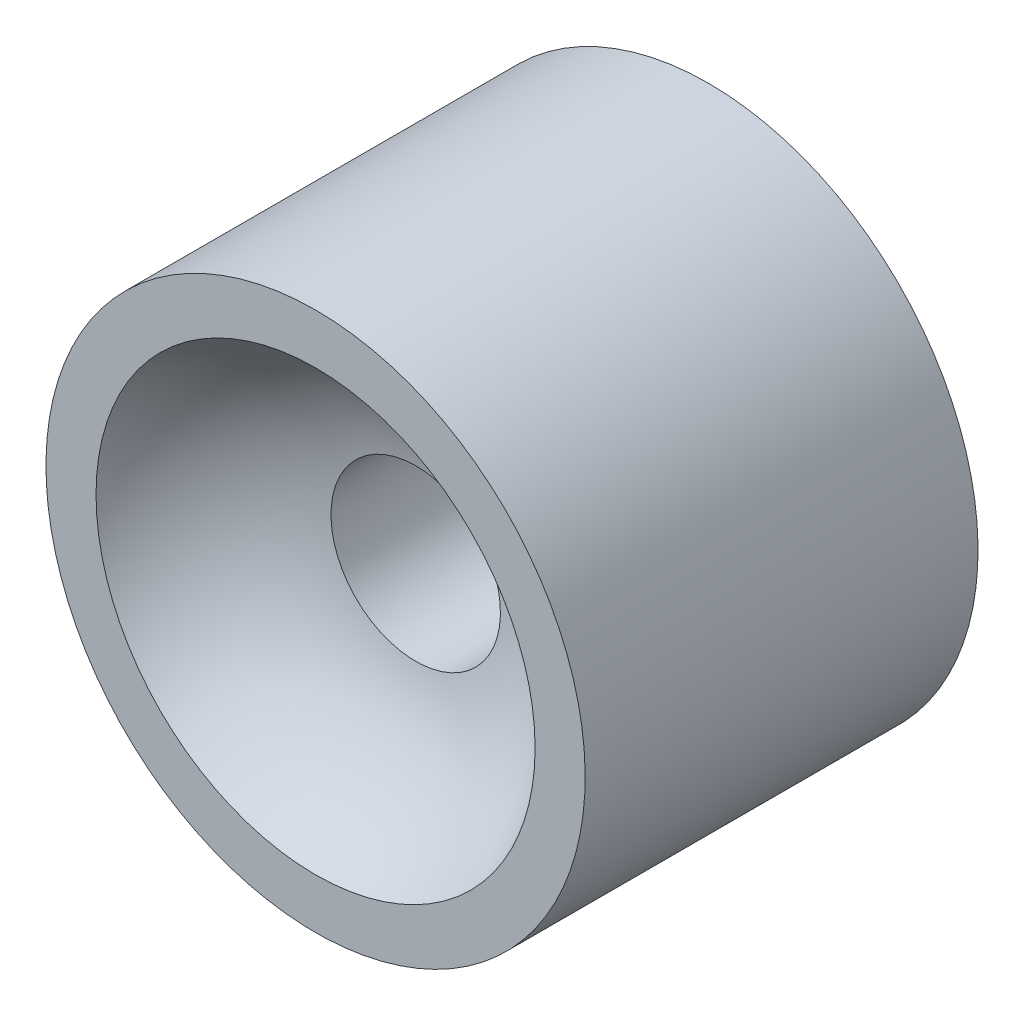
ISO-10303-21;
HEADER;
FILE_DESCRIPTION(('STEP AP214'),'2;1');
FILE_NAME('part.step','',(''),(''),'','','');
FILE_SCHEMA(('AUTOMOTIVE_DESIGN { 1 0 10303 214 1 1 1 1 }'));
ENDSEC;
DATA;
#1=APPLICATION_CONTEXT('core data for automotive mechanical design processes');
#2=APPLICATION_PROTOCOL_DEFINITION('international standard','automotive_design',2000,#1);
#3=PRODUCT_CONTEXT('',#1,'mechanical');
#4=PRODUCT('Part','Part','',(#3));
#5=PRODUCT_RELATED_PRODUCT_CATEGORY('part','',(#4));
#6=PRODUCT_DEFINITION_FORMATION('','',#4);
#7=PRODUCT_DEFINITION_CONTEXT('part definition',#1,'design');
#8=PRODUCT_DEFINITION('design','',#6,#7);
#9=PRODUCT_DEFINITION_SHAPE('','',#8);
#10=(LENGTH_UNIT() NAMED_UNIT(*) SI_UNIT(.MILLI.,.METRE.));
#11=(NAMED_UNIT(*) PLANE_ANGLE_UNIT() SI_UNIT($,.RADIAN.));
#12=(NAMED_UNIT(*) SI_UNIT($,.STERADIAN.) SOLID_ANGLE_UNIT());
#13=UNCERTAINTY_MEASURE_WITH_UNIT(LENGTH_MEASURE(1.E-05),#10,'distance_accuracy_value','');
#14=(GEOMETRIC_REPRESENTATION_CONTEXT(3) GLOBAL_UNCERTAINTY_ASSIGNED_CONTEXT((#13)) GLOBAL_UNIT_ASSIGNED_CONTEXT((#10,
#11,#12)) REPRESENTATION_CONTEXT('',''));
#15=CARTESIAN_POINT('',(0.,0.,0.));
#16=DIRECTION('',(0.,0.,1.));
#17=DIRECTION('',(1.,0.,0.));
#18=AXIS2_PLACEMENT_3D('',#15,#16,#17);
#19=CARTESIAN_POINT('',(0.,34.9999999999998,25.4999999999999));
#20=DIRECTION('',(0.,0.,0.999999999999998));
#21=DIRECTION('',(0.,-1.,0.));
#22=AXIS2_PLACEMENT_3D('',#19,#20,#21);
#23=PLANE('',#22);
#24=CARTESIAN_POINT('',(0.,0.,25.4999999999998));
#25=DIRECTION('',(0.,0.,-0.999999999999998));
#26=DIRECTION('',(0.,1.,0.));
#27=AXIS2_PLACEMENT_3D('',#24,#25,#26);
#28=CIRCLE('',#27,28.5);
#29=CARTESIAN_POINT('',(0.,28.5,25.4999999999998));
#30=VERTEX_POINT('',#29);
#31=EDGE_CURVE('E52',#30,#30,#28,.T.);
#32=ORIENTED_EDGE('',*,*,#31,.T.);
#33=EDGE_LOOP('',(#32));
#34=FACE_BOUND('',#33,.T.);
#35=CARTESIAN_POINT('',(0.,0.,25.4999999999998));
#36=DIRECTION('',(0.,0.,-0.999999999999998));
#37=DIRECTION('',(0.,1.,0.));
#38=AXIS2_PLACEMENT_3D('',#35,#36,#37);
#39=CIRCLE('',#38,35.);
#40=CARTESIAN_POINT('',(0.,35.,25.4999999999998));
#41=VERTEX_POINT('',#40);
#42=EDGE_CURVE('E10',#41,#41,#39,.T.);
#43=ORIENTED_EDGE('',*,*,#42,.F.);
#44=EDGE_LOOP('',(#43));
#45=FACE_BOUND('',#44,.T.);
#46=ADVANCED_FACE('F30',(#34,#45),#23,.T.);
#47=CARTESIAN_POINT('',(0.,0.,-12.5));
#48=DIRECTION('',(0.,0.,-0.999999999999998));
#49=DIRECTION('',(0.,1.,0.));
#50=AXIS2_PLACEMENT_3D('',#47,#48,#49);
#51=CYLINDRICAL_SURFACE('',#50,35.);
#52=CARTESIAN_POINT('',(0.,0.,-25.5));
#53=DIRECTION('',(0.,0.,-0.999999999999998));
#54=DIRECTION('',(0.,1.,0.));
#55=AXIS2_PLACEMENT_3D('',#52,#53,#54);
#56=CIRCLE('',#55,35.);
#57=CARTESIAN_POINT('',(0.,35.,-25.5));
#58=VERTEX_POINT('',#57);
#59=EDGE_CURVE('E36',#58,#58,#56,.T.);
#60=CARTESIAN_POINT('',(0.,35.,25.4999999999998));
#61=CARTESIAN_POINT('',(0.,35.,24.9687499999998));
#62=CARTESIAN_POINT('',(0.,35.,24.4374999999998));
#63=CARTESIAN_POINT('',(0.,35.,23.3749999999998));
#64=CARTESIAN_POINT('',(0.,35.,22.8437499999998));
#65=CARTESIAN_POINT('',(0.,35.,21.7812499999998));
#66=CARTESIAN_POINT('',(0.,35.,21.2499999999998));
#67=CARTESIAN_POINT('',(0.,35.,20.1874999999998));
#68=CARTESIAN_POINT('',(0.,35.,19.6562499999998));
#69=CARTESIAN_POINT('',(0.,35.,18.5937499999999));
#70=CARTESIAN_POINT('',(0.,35.,18.0624999999999));
#71=CARTESIAN_POINT('',(0.,35.,16.9999999999999));
#72=CARTESIAN_POINT('',(0.,35.,16.4687499999999));
#73=CARTESIAN_POINT('',(0.,35.,15.4062499999999));
#74=CARTESIAN_POINT('',(0.,35.,14.8749999999999));
#75=CARTESIAN_POINT('',(0.,35.,13.8124999999999));
#76=CARTESIAN_POINT('',(0.,35.,13.2812499999999));
#77=CARTESIAN_POINT('',(0.,35.,12.2187499999999));
#78=CARTESIAN_POINT('',(0.,35.,11.6874999999999));
#79=CARTESIAN_POINT('',(0.,35.,10.6249999999999));
#80=CARTESIAN_POINT('',(0.,35.,10.0937499999999));
#81=CARTESIAN_POINT('',(0.,35.,9.03124999999988));
#82=CARTESIAN_POINT('',(0.,35.,8.49999999999989));
#83=CARTESIAN_POINT('',(0.,35.,7.43749999999989));
#84=CARTESIAN_POINT('',(0.,35.,6.9062499999999));
#85=CARTESIAN_POINT('',(0.,35.,5.8437499999999));
#86=CARTESIAN_POINT('',(0.,35.,5.3124999999999));
#87=CARTESIAN_POINT('',(0.,35.,4.24999999999991));
#88=CARTESIAN_POINT('',(0.,35.,3.71874999999991));
#89=CARTESIAN_POINT('',(0.,35.,2.65624999999991));
#90=CARTESIAN_POINT('',(0.,35.,2.12499999999991));
#91=CARTESIAN_POINT('',(0.,35.,1.06249999999992));
#92=CARTESIAN_POINT('',(0.,35.,0.531249999999918));
#93=CARTESIAN_POINT('',(0.,35.,-0.531250000000078));
#94=CARTESIAN_POINT('',(0.,35.,-1.06250000000008));
#95=CARTESIAN_POINT('',(0.,35.,-2.12500000000007));
#96=CARTESIAN_POINT('',(0.,35.,-2.65625000000007));
#97=CARTESIAN_POINT('',(0.,35.,-3.71875000000007));
#98=CARTESIAN_POINT('',(0.,35.,-4.25000000000007));
#99=CARTESIAN_POINT('',(0.,35.,-5.31250000000006));
#100=CARTESIAN_POINT('',(0.,35.,-5.84375000000006));
#101=CARTESIAN_POINT('',(0.,35.,-6.90625000000006));
#102=CARTESIAN_POINT('',(0.,35.,-7.43750000000005));
#103=CARTESIAN_POINT('',(0.,35.,-8.50000000000005));
#104=CARTESIAN_POINT('',(0.,35.,-9.03125000000005));
#105=CARTESIAN_POINT('',(0.,35.,-10.09375));
#106=CARTESIAN_POINT('',(0.,35.,-10.625));
#107=CARTESIAN_POINT('',(0.,35.,-11.6875));
#108=CARTESIAN_POINT('',(0.,35.,-12.21875));
#109=CARTESIAN_POINT('',(0.,35.,-13.28125));
#110=CARTESIAN_POINT('',(0.,35.,-13.8125));
#111=CARTESIAN_POINT('',(0.,35.,-14.875));
#112=CARTESIAN_POINT('',(0.,35.,-15.40625));
#113=CARTESIAN_POINT('',(0.,35.,-16.46875));
#114=CARTESIAN_POINT('',(0.,35.,-17.));
#115=CARTESIAN_POINT('',(0.,35.,-18.0625));
#116=CARTESIAN_POINT('',(0.,35.,-18.59375));
#117=CARTESIAN_POINT('',(0.,35.,-19.65625));
#118=CARTESIAN_POINT('',(0.,35.,-20.1875));
#119=CARTESIAN_POINT('',(0.,35.,-21.25));
#120=CARTESIAN_POINT('',(0.,35.,-21.78125));
#121=CARTESIAN_POINT('',(0.,35.,-22.84375));
#122=CARTESIAN_POINT('',(0.,35.,-23.375));
#123=CARTESIAN_POINT('',(0.,35.,-24.4375));
#124=CARTESIAN_POINT('',(0.,35.,-24.96875));
#125=CARTESIAN_POINT('',(0.,35.,-25.5));
#126=B_SPLINE_CURVE_WITH_KNOTS('',3,(#60,#61,#62,#63,#64,#65,#66,#67,#68,#69,#70,#71,#72,#73,
#74,#75,#76,#77,#78,#79,#80,#81,#82,#83,#84,#85,#86,#87,#88,#89,#90,#91,#92,#93,#94,#95,#96,#97,
#98,#99,#100,#101,#102,#103,#104,#105,#106,#107,#108,#109,#110,#111,#112,#113,#114,#115,#116,
#117,#118,#119,#120,#121,#122,#123,#124,#125),.UNSPECIFIED.,.F.,.F.,(4,2,2,2,2,2,2,2,2,2,2,2,2,
2,2,2,2,2,2,2,2,2,2,2,2,2,2,2,2,2,2,2,4),(0.,1.59375,3.18749999999999,4.78124999999999,
6.37499999999998,7.96874999999997,9.56249999999996,11.15625,12.75,14.3437499999999,
15.9374999999999,17.5312499999999,19.1249999999999,20.7187499999999,22.3124999999999,
23.9062499999999,25.4999999999999,27.0937499999999,28.6874999999999,30.2812499999999,
31.8749999999999,33.4687499999999,35.0624999999999,36.6562499999999,38.2499999999999,
39.8437499999998,41.4374999999998,43.0312499999998,44.6249999999998,46.2187499999998,
47.8124999999998,49.4062499999998,50.9999999999998),.UNSPECIFIED.);
#127=EDGE_CURVE('BSEAM70',#41,#58,#126,.T.);
#128=ORIENTED_EDGE('',*,*,#42,.T.);
#129=ORIENTED_EDGE('',*,*,#59,.F.);
#130=ORIENTED_EDGE('',*,*,#127,.T.);
#131=ORIENTED_EDGE('',*,*,#127,.F.);
#132=EDGE_LOOP('',(#128,#130,#129,#131));
#133=FACE_BOUND('',#132,.T.);
#134=ADVANCED_FACE('F70',(#133),#51,.T.);
#135=CARTESIAN_POINT('',(0.,34.9999999999999,-25.5));
#136=DIRECTION('',(0.,0.,-0.999999999999998));
#137=DIRECTION('',(0.,1.,0.));
#138=AXIS2_PLACEMENT_3D('',#135,#136,#137);
#139=PLANE('',#138);
#140=ORIENTED_EDGE('',*,*,#59,.T.);
#141=EDGE_LOOP('',(#140));
#142=FACE_BOUND('',#141,.T.);
#143=CARTESIAN_POINT('',(0.,0.,-25.5));
#144=DIRECTION('',(0.,0.,-0.999999999999998));
#145=DIRECTION('',(0.,1.,0.));
#146=AXIS2_PLACEMENT_3D('',#143,#144,#145);
#147=CIRCLE('',#146,28.5);
#148=CARTESIAN_POINT('',(0.,28.4999999999999,-25.5));
#149=VERTEX_POINT('',#148);
#150=EDGE_CURVE('E40',#149,#149,#147,.T.);
#151=ORIENTED_EDGE('',*,*,#150,.F.);
#152=EDGE_LOOP('',(#151));
#153=FACE_BOUND('',#152,.T.);
#154=ADVANCED_FACE('F74',(#142,#153),#139,.T.);
#155=CARTESIAN_POINT('',(1.38777878078145E-13,0.,-37.0606216225508));
#156=DIRECTION('',(0.,0.,-0.999999999999998));
#157=DIRECTION('',(0.,1.,0.));
#158=AXIS2_PLACEMENT_3D('',#155,#156,#157);
#159=DEGENERATE_TOROIDAL_SURFACE('',#158,6.33353822324793,25.,.T.);
#160=ORIENTED_EDGE('',*,*,#150,.T.);
#161=EDGE_LOOP('',(#160));
#162=FACE_BOUND('',#161,.T.);
#163=CARTESIAN_POINT('',(0.,0.,-12.5));
#164=DIRECTION('',(0.,0.,-0.999999999999998));
#165=DIRECTION('',(0.,1.,0.));
#166=AXIS2_PLACEMENT_3D('',#163,#164,#165);
#167=CIRCLE('',#166,11.);
#168=CARTESIAN_POINT('',(0.,11.,-12.5));
#169=VERTEX_POINT('',#168);
#170=EDGE_CURVE('E44',#169,#169,#167,.T.);
#171=ORIENTED_EDGE('',*,*,#170,.F.);
#172=EDGE_LOOP('',(#171));
#173=FACE_BOUND('',#172,.T.);
#174=ADVANCED_FACE('F66',(#162,#173),#159,.F.);
#175=CARTESIAN_POINT('',(0.,0.,-12.5));
#176=DIRECTION('',(0.,0.,-0.999999999999998));
#177=DIRECTION('',(0.,1.,0.));
#178=AXIS2_PLACEMENT_3D('',#175,#176,#177);
#179=CYLINDRICAL_SURFACE('',#178,11.);
#180=CARTESIAN_POINT('',(0.,-2.08166817117217E-13,12.5));
#181=DIRECTION('',(0.,0.,-0.999999999999998));
#182=DIRECTION('',(0.,1.,0.));
#183=AXIS2_PLACEMENT_3D('',#180,#181,#182);
#184=CIRCLE('',#183,11.);
#185=CARTESIAN_POINT('',(0.,11.,12.5));
#186=VERTEX_POINT('',#185);
#187=EDGE_CURVE('E49',#186,#186,#184,.T.);
#188=CARTESIAN_POINT('',(0.,11.,-12.5));
#189=CARTESIAN_POINT('',(0.,11.,-12.2395833333333));
#190=CARTESIAN_POINT('',(0.,11.,-11.9791666666667));
#191=CARTESIAN_POINT('',(0.,11.,-11.4583333333333));
#192=CARTESIAN_POINT('',(0.,11.,-11.1979166666667));
#193=CARTESIAN_POINT('',(0.,11.,-10.6770833333333));
#194=CARTESIAN_POINT('',(0.,11.,-10.4166666666667));
#195=CARTESIAN_POINT('',(0.,11.,-9.89583333333333));
#196=CARTESIAN_POINT('',(0.,11.,-9.63541666666666));
#197=CARTESIAN_POINT('',(0.,11.,-9.11458333333333));
#198=CARTESIAN_POINT('',(0.,11.,-8.85416666666666));
#199=CARTESIAN_POINT('',(0.,11.,-8.33333333333333));
#200=CARTESIAN_POINT('',(0.,11.,-8.07291666666666));
#201=CARTESIAN_POINT('',(0.,11.,-7.55208333333333));
#202=CARTESIAN_POINT('',(0.,11.,-7.29166666666666));
#203=CARTESIAN_POINT('',(0.,11.,-6.77083333333333));
#204=CARTESIAN_POINT('',(0.,11.,-6.51041666666666));
#205=CARTESIAN_POINT('',(0.,11.,-5.98958333333333));
#206=CARTESIAN_POINT('',(0.,11.,-5.72916666666666));
#207=CARTESIAN_POINT('',(0.,11.,-5.20833333333333));
#208=CARTESIAN_POINT('',(0.,11.,-4.94791666666666));
#209=CARTESIAN_POINT('',(0.,11.,-4.42708333333333));
#210=CARTESIAN_POINT('',(0.,11.,-4.16666666666666));
#211=CARTESIAN_POINT('',(0.,11.,-3.64583333333333));
#212=CARTESIAN_POINT('',(0.,11.,-3.38541666666666));
#213=CARTESIAN_POINT('',(0.,11.,-2.86458333333333));
#214=CARTESIAN_POINT('',(0.,11.,-2.60416666666666));
#215=CARTESIAN_POINT('',(0.,11.,-2.08333333333333));
#216=CARTESIAN_POINT('',(0.,11.,-1.82291666666666));
#217=CARTESIAN_POINT('',(0.,11.,-1.30208333333333));
#218=CARTESIAN_POINT('',(0.,11.,-1.04166666666666));
#219=CARTESIAN_POINT('',(0.,11.,-0.520833333333329));
#220=CARTESIAN_POINT('',(0.,11.,-0.260416666666663));
#221=CARTESIAN_POINT('',(0.,11.,0.26041666666667));
#222=CARTESIAN_POINT('',(0.,11.,0.520833333333336));
#223=CARTESIAN_POINT('',(0.,11.,1.04166666666667));
#224=CARTESIAN_POINT('',(0.,11.,1.30208333333334));
#225=CARTESIAN_POINT('',(0.,11.,1.82291666666667));
#226=CARTESIAN_POINT('',(0.,11.,2.08333333333334));
#227=CARTESIAN_POINT('',(0.,11.,2.60416666666667));
#228=CARTESIAN_POINT('',(0.,11.,2.86458333333334));
#229=CARTESIAN_POINT('',(0.,11.,3.38541666666667));
#230=CARTESIAN_POINT('',(0.,11.,3.64583333333333));
#231=CARTESIAN_POINT('',(0.,11.,4.16666666666667));
#232=CARTESIAN_POINT('',(0.,11.,4.42708333333334));
#233=CARTESIAN_POINT('',(0.,11.,4.94791666666667));
#234=CARTESIAN_POINT('',(0.,11.,5.20833333333334));
#235=CARTESIAN_POINT('',(0.,11.,5.72916666666667));
#236=CARTESIAN_POINT('',(0.,11.,5.98958333333334));
#237=CARTESIAN_POINT('',(0.,11.,6.51041666666667));
#238=CARTESIAN_POINT('',(0.,11.,6.77083333333333));
#239=CARTESIAN_POINT('',(0.,11.,7.29166666666667));
#240=CARTESIAN_POINT('',(0.,11.,7.55208333333333));
#241=CARTESIAN_POINT('',(0.,11.,8.07291666666667));
#242=CARTESIAN_POINT('',(0.,11.,8.33333333333333));
#243=CARTESIAN_POINT('',(0.,11.,8.85416666666667));
#244=CARTESIAN_POINT('',(0.,11.,9.11458333333333));
#245=CARTESIAN_POINT('',(0.,11.,9.63541666666667));
#246=CARTESIAN_POINT('',(0.,11.,9.89583333333333));
#247=CARTESIAN_POINT('',(0.,11.,10.4166666666667));
#248=CARTESIAN_POINT('',(0.,11.,10.6770833333333));
#249=CARTESIAN_POINT('',(0.,11.,11.1979166666667));
#250=CARTESIAN_POINT('',(0.,11.,11.4583333333333));
#251=CARTESIAN_POINT('',(0.,11.,11.9791666666667));
#252=CARTESIAN_POINT('',(0.,11.,12.2395833333333));
#253=CARTESIAN_POINT('',(0.,11.,12.5));
#254=B_SPLINE_CURVE_WITH_KNOTS('',3,(#188,#189,#190,#191,#192,#193,#194,#195,#196,#197,#198,
#199,#200,#201,#202,#203,#204,#205,#206,#207,#208,#209,#210,#211,#212,#213,#214,#215,#216,#217,
#218,#219,#220,#221,#222,#223,#224,#225,#226,#227,#228,#229,#230,#231,#232,#233,#234,#235,#236,
#237,#238,#239,#240,#241,#242,#243,#244,#245,#246,#247,#248,#249,#250,#251,#252,#253),
.UNSPECIFIED.,.F.,.F.,(4,2,2,2,2,2,2,2,2,2,2,2,2,2,2,2,2,2,2,2,2,2,2,2,2,2,2,2,2,2,2,2,4),(0.,
0.781249999999999,1.5625,2.34375,3.125,3.90625,4.6875,5.46875,6.25,7.03125,7.8125,8.59375,9.375,
10.15625,10.9375,11.71875,12.5,13.28125,14.0625,14.84375,15.625,16.40625,17.1875,17.96875,18.75,
19.53125,20.3125,21.09375,21.875,22.65625,23.4375,24.21875,25.),.UNSPECIFIED.);
#255=EDGE_CURVE('BSEAM60',#169,#186,#254,.T.);
#256=ORIENTED_EDGE('',*,*,#170,.T.);
#257=ORIENTED_EDGE('',*,*,#187,.F.);
#258=ORIENTED_EDGE('',*,*,#255,.T.);
#259=ORIENTED_EDGE('',*,*,#255,.F.);
#260=EDGE_LOOP('',(#256,#258,#257,#259));
#261=FACE_BOUND('',#260,.T.);
#262=ADVANCED_FACE('F60',(#261),#179,.F.);
#263=CARTESIAN_POINT('',(0.,-1.38777878078145E-13,37.0606216225507));
#264=DIRECTION('',(0.,0.,-0.999999999999998));
#265=DIRECTION('',(0.,1.,0.));
#266=AXIS2_PLACEMENT_3D('',#263,#264,#265);
#267=DEGENERATE_TOROIDAL_SURFACE('',#266,6.33353822324795,25.,.T.);
#268=ORIENTED_EDGE('',*,*,#187,.T.);
#269=EDGE_LOOP('',(#268));
#270=FACE_BOUND('',#269,.T.);
#271=ORIENTED_EDGE('',*,*,#31,.F.);
#272=EDGE_LOOP('',(#271));
#273=FACE_BOUND('',#272,.T.);
#274=ADVANCED_FACE('F58',(#270,#273),#267,.F.);
#275=CLOSED_SHELL('',(#46,#134,#154,#174,#262,#274));
#276=MANIFOLD_SOLID_BREP('B2',#275);
#277=ADVANCED_BREP_SHAPE_REPRESENTATION('',(#18,#276),#14);
#278=SHAPE_DEFINITION_REPRESENTATION(#9,#277);
ENDSEC;
END-ISO-10303-21;
